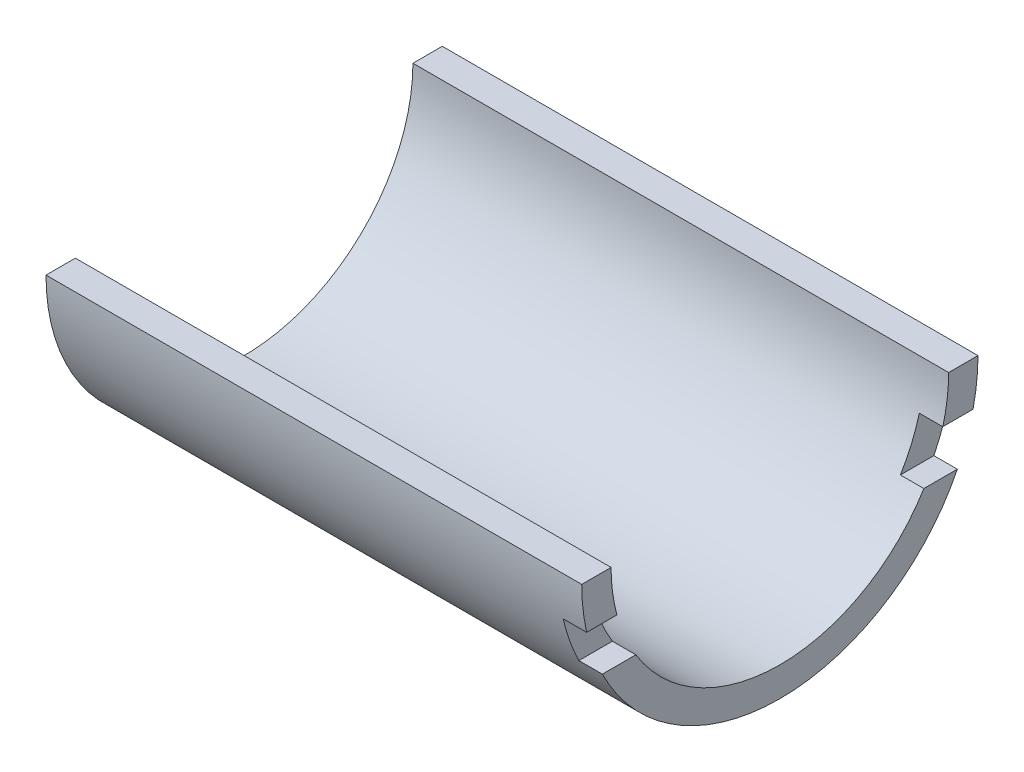
ISO-10303-21;
HEADER;
FILE_DESCRIPTION(('STEP AP214'),'2;1');
FILE_NAME('part.step','',(''),(''),'','','');
FILE_SCHEMA(('AUTOMOTIVE_DESIGN { 1 0 10303 214 1 1 1 1 }'));
ENDSEC;
DATA;
#1=APPLICATION_CONTEXT('core data for automotive mechanical design processes');
#2=APPLICATION_PROTOCOL_DEFINITION('international standard','automotive_design',2000,#1);
#3=PRODUCT_CONTEXT('',#1,'mechanical');
#4=PRODUCT('Part','Part','',(#3));
#5=PRODUCT_RELATED_PRODUCT_CATEGORY('part','',(#4));
#6=PRODUCT_DEFINITION_FORMATION('','',#4);
#7=PRODUCT_DEFINITION_CONTEXT('part definition',#1,'design');
#8=PRODUCT_DEFINITION('design','',#6,#7);
#9=PRODUCT_DEFINITION_SHAPE('','',#8);
#10=(LENGTH_UNIT() NAMED_UNIT(*) SI_UNIT(.MILLI.,.METRE.));
#11=(NAMED_UNIT(*) PLANE_ANGLE_UNIT() SI_UNIT($,.RADIAN.));
#12=(NAMED_UNIT(*) SI_UNIT($,.STERADIAN.) SOLID_ANGLE_UNIT());
#13=UNCERTAINTY_MEASURE_WITH_UNIT(LENGTH_MEASURE(1.E-05),#10,'distance_accuracy_value','');
#14=(GEOMETRIC_REPRESENTATION_CONTEXT(3) GLOBAL_UNCERTAINTY_ASSIGNED_CONTEXT((#13)) GLOBAL_UNIT_ASSIGNED_CONTEXT((#10,
#11,#12)) REPRESENTATION_CONTEXT('',''));
#15=CARTESIAN_POINT('',(0.,0.,0.));
#16=DIRECTION('',(0.,0.,1.));
#17=DIRECTION('',(1.,0.,0.));
#18=AXIS2_PLACEMENT_3D('',#15,#16,#17);
#19=CARTESIAN_POINT('',(36.5,0.,0.));
#20=DIRECTION('',(1.,0.,0.));
#21=DIRECTION('',(0.,0.,-1.));
#22=AXIS2_PLACEMENT_3D('',#19,#20,#21);
#23=PLANE('',#22);
#24=DIRECTION('',(0.,0.,-1.));
#25=VECTOR('',#24,1.);
#26=CARTESIAN_POINT('',(36.5,-12.,0.));
#27=LINE('',#26,#25);
#28=CARTESIAN_POINT('',(36.5,-12.,24.1867732448957));
#29=VERTEX_POINT('',#28);
#30=CARTESIAN_POINT('',(36.5,-12.,19.6214168703486));
#31=VERTEX_POINT('',#30);
#32=EDGE_CURVE('E150',#29,#31,#27,.T.);
#33=ORIENTED_EDGE('',*,*,#32,.F.);
#34=CARTESIAN_POINT('',(36.5,0.,0.));
#35=DIRECTION('',(1.,0.,0.));
#36=DIRECTION('',(0.,0.,-1.));
#37=AXIS2_PLACEMENT_3D('',#34,#35,#36);
#38=CIRCLE('',#37,27.);
#39=CARTESIAN_POINT('',(36.5,-12.,-24.1867732448957));
#40=VERTEX_POINT('',#39);
#41=EDGE_CURVE('E185',#29,#40,#38,.T.);
#42=ORIENTED_EDGE('',*,*,#41,.T.);
#43=CARTESIAN_POINT('',(36.5,-12.,-19.6214168703486));
#44=VERTEX_POINT('',#43);
#45=EDGE_CURVE('E151',#44,#40,#27,.T.);
#46=ORIENTED_EDGE('',*,*,#45,.F.);
#47=CARTESIAN_POINT('',(36.5,0.,0.));
#48=DIRECTION('',(1.,0.,0.));
#49=DIRECTION('',(0.,0.,-1.));
#50=AXIS2_PLACEMENT_3D('',#47,#48,#49);
#51=CIRCLE('',#50,23.);
#52=EDGE_CURVE('E193',#31,#44,#51,.T.);
#53=ORIENTED_EDGE('',*,*,#52,.F.);
#54=EDGE_LOOP('',(#33,#42,#46,#53));
#55=FACE_BOUND('',#54,.T.);
#56=ADVANCED_FACE('F39',(#55),#23,.T.);
#57=DIRECTION('',(0.,0.,1.));
#58=VECTOR('',#57,1.);
#59=CARTESIAN_POINT('',(36.5,-6.,0.));
#60=LINE('',#59,#58);
#61=CARTESIAN_POINT('',(36.5,-6.,-26.3248931621764));
#62=VERTEX_POINT('',#61);
#63=CARTESIAN_POINT('',(36.5,-6.,-22.2036033111745));
#64=VERTEX_POINT('',#63);
#65=EDGE_CURVE('E155',#62,#64,#60,.T.);
#66=ORIENTED_EDGE('',*,*,#65,.F.);
#67=CARTESIAN_POINT('',(36.5,0.,-27.));
#68=VERTEX_POINT('',#67);
#69=EDGE_CURVE('E186',#62,#68,#38,.T.);
#70=ORIENTED_EDGE('',*,*,#69,.T.);
#71=DIRECTION('',(0.,0.,-1.));
#72=VECTOR('',#71,1.);
#73=CARTESIAN_POINT('',(36.5,0.,-23.));
#74=LINE('',#73,#72);
#75=CARTESIAN_POINT('',(36.5,0.,-23.));
#76=VERTEX_POINT('',#75);
#77=EDGE_CURVE('E187',#76,#68,#74,.T.);
#78=ORIENTED_EDGE('',*,*,#77,.F.);
#79=EDGE_CURVE('E170',#64,#76,#51,.T.);
#80=ORIENTED_EDGE('',*,*,#79,.F.);
#81=EDGE_LOOP('',(#66,#70,#78,#80));
#82=FACE_BOUND('',#81,.T.);
#83=ADVANCED_FACE('F230',(#82),#23,.T.);
#84=CARTESIAN_POINT('',(36.5,0.,0.));
#85=DIRECTION('',(-1.,0.,0.));
#86=DIRECTION('',(0.,0.,1.));
#87=AXIS2_PLACEMENT_3D('',#84,#85,#86);
#88=CYLINDRICAL_SURFACE('',#87,23.);
#89=DIRECTION('',(-1.,0.,0.));
#90=VECTOR('',#89,1.);
#91=CARTESIAN_POINT('',(36.5,-12.,-19.6214168703486));
#92=LINE('',#91,#90);
#93=CARTESIAN_POINT('',(33.3,-12.,-19.6214168703486));
#94=VERTEX_POINT('',#93);
#95=EDGE_CURVE('E198',#94,#44,#92,.F.);
#96=ORIENTED_EDGE('',*,*,#95,.F.);
#97=CARTESIAN_POINT('',(33.3,0.,0.));
#98=DIRECTION('',(-1.,0.,0.));
#99=DIRECTION('',(0.,0.,1.));
#100=AXIS2_PLACEMENT_3D('',#97,#98,#99);
#101=CIRCLE('',#100,23.);
#102=CARTESIAN_POINT('',(33.3,-6.,-22.2036033111745));
#103=VERTEX_POINT('',#102);
#104=EDGE_CURVE('E180',#103,#94,#101,.T.);
#105=ORIENTED_EDGE('',*,*,#104,.F.);
#106=DIRECTION('',(-1.,0.,0.));
#107=VECTOR('',#106,1.);
#108=CARTESIAN_POINT('',(36.5,-5.99999999999999,-22.2036033111745));
#109=LINE('',#108,#107);
#110=EDGE_CURVE('E203',#64,#103,#109,.T.);
#111=ORIENTED_EDGE('',*,*,#110,.F.);
#112=ORIENTED_EDGE('',*,*,#79,.T.);
#113=DIRECTION('',(-1.,0.,0.));
#114=VECTOR('',#113,1.);
#115=CARTESIAN_POINT('',(36.5,0.,-23.));
#116=LINE('',#115,#114);
#117=CARTESIAN_POINT('',(-36.5,0.,-23.));
#118=VERTEX_POINT('',#117);
#119=EDGE_CURVE('E159',#76,#118,#116,.T.);
#120=ORIENTED_EDGE('',*,*,#119,.T.);
#121=CARTESIAN_POINT('',(-36.5,0.,0.));
#122=DIRECTION('',(1.,0.,0.));
#123=DIRECTION('',(0.,0.,-1.));
#124=AXIS2_PLACEMENT_3D('',#121,#122,#123);
#125=CIRCLE('',#124,23.);
#126=CARTESIAN_POINT('',(-36.5,0.,23.));
#127=VERTEX_POINT('',#126);
#128=EDGE_CURVE('E177',#127,#118,#125,.T.);
#129=ORIENTED_EDGE('',*,*,#128,.F.);
#130=DIRECTION('',(-1.,0.,0.));
#131=VECTOR('',#130,1.);
#132=CARTESIAN_POINT('',(36.5,0.,23.));
#133=LINE('',#132,#131);
#134=CARTESIAN_POINT('',(36.5,0.,23.));
#135=VERTEX_POINT('',#134);
#136=EDGE_CURVE('E158',#135,#127,#133,.T.);
#137=ORIENTED_EDGE('',*,*,#136,.F.);
#138=CARTESIAN_POINT('',(36.5,-6.,22.2036033111745));
#139=VERTEX_POINT('',#138);
#140=EDGE_CURVE('E190',#135,#139,#51,.T.);
#141=ORIENTED_EDGE('',*,*,#140,.T.);
#142=DIRECTION('',(-1.,0.,0.));
#143=VECTOR('',#142,1.);
#144=CARTESIAN_POINT('',(36.5,-5.99999999999999,22.2036033111745));
#145=LINE('',#144,#143);
#146=CARTESIAN_POINT('',(33.3,-6.,22.2036033111745));
#147=VERTEX_POINT('',#146);
#148=EDGE_CURVE('E62',#147,#139,#145,.F.);
#149=ORIENTED_EDGE('',*,*,#148,.F.);
#150=CARTESIAN_POINT('',(33.3,-12.,19.6214168703486));
#151=VERTEX_POINT('',#150);
#152=EDGE_CURVE('E143',#151,#147,#101,.T.);
#153=ORIENTED_EDGE('',*,*,#152,.F.);
#154=DIRECTION('',(-1.,0.,0.));
#155=VECTOR('',#154,1.);
#156=CARTESIAN_POINT('',(36.5,-12.,19.6214168703486));
#157=LINE('',#156,#155);
#158=EDGE_CURVE('E195',#31,#151,#157,.T.);
#159=ORIENTED_EDGE('',*,*,#158,.F.);
#160=ORIENTED_EDGE('',*,*,#52,.T.);
#161=EDGE_LOOP('',(#96,#105,#111,#112,#120,#129,#137,#141,#149,#153,#159,#160));
#162=FACE_BOUND('',#161,.T.);
#163=ADVANCED_FACE('F41',(#162),#88,.F.);
#164=CARTESIAN_POINT('',(36.5,0.,27.));
#165=DIRECTION('',(0.,1.,0.));
#166=DIRECTION('',(0.,0.,1.));
#167=AXIS2_PLACEMENT_3D('',#164,#165,#166);
#168=PLANE('',#167);
#169=DIRECTION('',(0.,0.,-1.));
#170=VECTOR('',#169,1.);
#171=CARTESIAN_POINT('',(-36.5,0.,27.));
#172=LINE('',#171,#170);
#173=CARTESIAN_POINT('',(-36.5,0.,27.));
#174=VERTEX_POINT('',#173);
#175=EDGE_CURVE('E167',#174,#127,#172,.T.);
#176=ORIENTED_EDGE('',*,*,#175,.F.);
#177=DIRECTION('',(-1.,0.,0.));
#178=VECTOR('',#177,1.);
#179=CARTESIAN_POINT('',(36.5,0.,27.));
#180=LINE('',#179,#178);
#181=CARTESIAN_POINT('',(36.5,0.,27.));
#182=VERTEX_POINT('',#181);
#183=EDGE_CURVE('E164',#182,#174,#180,.T.);
#184=ORIENTED_EDGE('',*,*,#183,.F.);
#185=DIRECTION('',(0.,0.,-1.));
#186=VECTOR('',#185,1.);
#187=CARTESIAN_POINT('',(36.5,0.,27.));
#188=LINE('',#187,#186);
#189=EDGE_CURVE('E162',#182,#135,#188,.T.);
#190=ORIENTED_EDGE('',*,*,#189,.T.);
#191=ORIENTED_EDGE('',*,*,#136,.T.);
#192=EDGE_LOOP('',(#176,#184,#190,#191));
#193=FACE_BOUND('',#192,.T.);
#194=ADVANCED_FACE('F242',(#193),#168,.T.);
#195=CARTESIAN_POINT('',(36.5,0.,0.));
#196=DIRECTION('',(-1.,0.,0.));
#197=DIRECTION('',(0.,0.,1.));
#198=AXIS2_PLACEMENT_3D('',#195,#196,#197);
#199=CYLINDRICAL_SURFACE('',#198,27.);
#200=CARTESIAN_POINT('',(33.3,0.,0.));
#201=DIRECTION('',(-1.,0.,0.));
#202=DIRECTION('',(0.,0.,1.));
#203=AXIS2_PLACEMENT_3D('',#200,#201,#202);
#204=CIRCLE('',#203,27.);
#205=CARTESIAN_POINT('',(33.3,-6.,-26.3248931621764));
#206=VERTEX_POINT('',#205);
#207=CARTESIAN_POINT('',(33.3,-12.,-24.1867732448957));
#208=VERTEX_POINT('',#207);
#209=EDGE_CURVE('E11',#206,#208,#204,.T.);
#210=ORIENTED_EDGE('',*,*,#209,.T.);
#211=DIRECTION('',(-1.,0.,0.));
#212=VECTOR('',#211,1.);
#213=CARTESIAN_POINT('',(36.5,-12.,-24.1867732448957));
#214=LINE('',#213,#212);
#215=EDGE_CURVE('E200',#208,#40,#214,.F.);
#216=ORIENTED_EDGE('',*,*,#215,.T.);
#217=ORIENTED_EDGE('',*,*,#41,.F.);
#218=DIRECTION('',(-1.,0.,0.));
#219=VECTOR('',#218,1.);
#220=CARTESIAN_POINT('',(36.5,-12.,24.1867732448957));
#221=LINE('',#220,#219);
#222=CARTESIAN_POINT('',(33.3,-12.,24.1867732448957));
#223=VERTEX_POINT('',#222);
#224=EDGE_CURVE('E149',#29,#223,#221,.T.);
#225=ORIENTED_EDGE('',*,*,#224,.T.);
#226=CARTESIAN_POINT('',(33.3,-6.,26.3248931621764));
#227=VERTEX_POINT('',#226);
#228=EDGE_CURVE('E43',#223,#227,#204,.T.);
#229=ORIENTED_EDGE('',*,*,#228,.T.);
#230=DIRECTION('',(-1.,0.,0.));
#231=VECTOR('',#230,1.);
#232=CARTESIAN_POINT('',(36.5,-5.99999999999999,26.3248931621764));
#233=LINE('',#232,#231);
#234=CARTESIAN_POINT('',(36.5,-6.,26.3248931621764));
#235=VERTEX_POINT('',#234);
#236=EDGE_CURVE('E128',#227,#235,#233,.F.);
#237=ORIENTED_EDGE('',*,*,#236,.T.);
#238=EDGE_CURVE('E183',#182,#235,#38,.T.);
#239=ORIENTED_EDGE('',*,*,#238,.F.);
#240=ORIENTED_EDGE('',*,*,#183,.T.);
#241=CARTESIAN_POINT('',(-36.5,0.,0.));
#242=DIRECTION('',(1.,0.,0.));
#243=DIRECTION('',(0.,0.,-1.));
#244=AXIS2_PLACEMENT_3D('',#241,#242,#243);
#245=CIRCLE('',#244,27.);
#246=CARTESIAN_POINT('',(-36.5,0.,-27.));
#247=VERTEX_POINT('',#246);
#248=EDGE_CURVE('E171',#174,#247,#245,.T.);
#249=ORIENTED_EDGE('',*,*,#248,.T.);
#250=DIRECTION('',(-1.,0.,0.));
#251=VECTOR('',#250,1.);
#252=CARTESIAN_POINT('',(36.5,0.,-27.));
#253=LINE('',#252,#251);
#254=EDGE_CURVE('E161',#68,#247,#253,.T.);
#255=ORIENTED_EDGE('',*,*,#254,.F.);
#256=ORIENTED_EDGE('',*,*,#69,.F.);
#257=DIRECTION('',(-1.,0.,0.));
#258=VECTOR('',#257,1.);
#259=CARTESIAN_POINT('',(36.5,-5.99999999999999,-26.3248931621764));
#260=LINE('',#259,#258);
#261=EDGE_CURVE('E54',#62,#206,#260,.T.);
#262=ORIENTED_EDGE('',*,*,#261,.T.);
#263=EDGE_LOOP('',(#210,#216,#217,#225,#229,#237,#239,#240,#249,#255,#256,#262));
#264=FACE_BOUND('',#263,.T.);
#265=ADVANCED_FACE('F147',(#264),#199,.T.);
#266=CARTESIAN_POINT('',(36.5,0.,-23.));
#267=DIRECTION('',(0.,1.,0.));
#268=DIRECTION('',(0.,0.,1.));
#269=AXIS2_PLACEMENT_3D('',#266,#267,#268);
#270=PLANE('',#269);
#271=DIRECTION('',(0.,0.,-1.));
#272=VECTOR('',#271,1.);
#273=CARTESIAN_POINT('',(-36.5,0.,-23.));
#274=LINE('',#273,#272);
#275=EDGE_CURVE('E174',#118,#247,#274,.T.);
#276=ORIENTED_EDGE('',*,*,#275,.F.);
#277=ORIENTED_EDGE('',*,*,#119,.F.);
#278=ORIENTED_EDGE('',*,*,#77,.T.);
#279=ORIENTED_EDGE('',*,*,#254,.T.);
#280=EDGE_LOOP('',(#276,#277,#278,#279));
#281=FACE_BOUND('',#280,.T.);
#282=ADVANCED_FACE('F229',(#281),#270,.T.);
#283=EDGE_CURVE('E132',#139,#235,#60,.T.);
#284=ORIENTED_EDGE('',*,*,#283,.F.);
#285=ORIENTED_EDGE('',*,*,#140,.F.);
#286=ORIENTED_EDGE('',*,*,#189,.F.);
#287=ORIENTED_EDGE('',*,*,#238,.T.);
#288=EDGE_LOOP('',(#284,#285,#286,#287));
#289=FACE_BOUND('',#288,.T.);
#290=ADVANCED_FACE('F241',(#289),#23,.T.);
#291=CARTESIAN_POINT('',(-36.5,0.,0.));
#292=DIRECTION('',(1.,0.,0.));
#293=DIRECTION('',(0.,0.,-1.));
#294=AXIS2_PLACEMENT_3D('',#291,#292,#293);
#295=PLANE('',#294);
#296=ORIENTED_EDGE('',*,*,#128,.T.);
#297=ORIENTED_EDGE('',*,*,#275,.T.);
#298=ORIENTED_EDGE('',*,*,#248,.F.);
#299=ORIENTED_EDGE('',*,*,#175,.T.);
#300=EDGE_LOOP('',(#296,#297,#298,#299));
#301=FACE_BOUND('',#300,.T.);
#302=ADVANCED_FACE('F236',(#301),#295,.F.);
#303=CARTESIAN_POINT('',(36.500012,-6.,0.));
#304=DIRECTION('',(0.,1.,0.));
#305=DIRECTION('',(0.,0.,1.));
#306=AXIS2_PLACEMENT_3D('',#303,#304,#305);
#307=PLANE('',#306);
#308=ORIENTED_EDGE('',*,*,#148,.T.);
#309=ORIENTED_EDGE('',*,*,#283,.T.);
#310=ORIENTED_EDGE('',*,*,#236,.F.);
#311=DIRECTION('',(0.,0.,-1.));
#312=VECTOR('',#311,1.);
#313=CARTESIAN_POINT('',(33.3,-6.,0.));
#314=LINE('',#313,#312);
#315=EDGE_CURVE('E131',#227,#147,#314,.T.);
#316=ORIENTED_EDGE('',*,*,#315,.T.);
#317=EDGE_LOOP('',(#308,#309,#310,#316));
#318=FACE_BOUND('',#317,.T.);
#319=ADVANCED_FACE('F130',(#318),#307,.F.);
#320=CARTESIAN_POINT('',(36.500012,-12.,0.));
#321=DIRECTION('',(0.,-1.,0.));
#322=DIRECTION('',(0.,0.,-1.));
#323=AXIS2_PLACEMENT_3D('',#320,#321,#322);
#324=PLANE('',#323);
#325=ORIENTED_EDGE('',*,*,#158,.T.);
#326=DIRECTION('',(0.,0.,1.));
#327=VECTOR('',#326,1.);
#328=CARTESIAN_POINT('',(33.3,-12.,0.));
#329=LINE('',#328,#327);
#330=EDGE_CURVE('E208',#151,#223,#329,.T.);
#331=ORIENTED_EDGE('',*,*,#330,.T.);
#332=ORIENTED_EDGE('',*,*,#224,.F.);
#333=ORIENTED_EDGE('',*,*,#32,.T.);
#334=EDGE_LOOP('',(#325,#331,#332,#333));
#335=FACE_BOUND('',#334,.T.);
#336=ADVANCED_FACE('F292',(#335),#324,.F.);
#337=CARTESIAN_POINT('',(33.3,0.,0.));
#338=DIRECTION('',(-1.,0.,0.));
#339=DIRECTION('',(0.,0.,1.));
#340=AXIS2_PLACEMENT_3D('',#337,#338,#339);
#341=PLANE('',#340);
#342=ORIENTED_EDGE('',*,*,#152,.T.);
#343=ORIENTED_EDGE('',*,*,#315,.F.);
#344=ORIENTED_EDGE('',*,*,#228,.F.);
#345=ORIENTED_EDGE('',*,*,#330,.F.);
#346=EDGE_LOOP('',(#342,#343,#344,#345));
#347=FACE_BOUND('',#346,.T.);
#348=ADVANCED_FACE('F139',(#347),#341,.F.);
#349=ORIENTED_EDGE('',*,*,#104,.T.);
#350=EDGE_CURVE('E207',#208,#94,#329,.T.);
#351=ORIENTED_EDGE('',*,*,#350,.F.);
#352=ORIENTED_EDGE('',*,*,#209,.F.);
#353=EDGE_CURVE('E144',#103,#206,#314,.T.);
#354=ORIENTED_EDGE('',*,*,#353,.F.);
#355=EDGE_LOOP('',(#349,#351,#352,#354));
#356=FACE_BOUND('',#355,.T.);
#357=ADVANCED_FACE('F309',(#356),#341,.F.);
#358=ORIENTED_EDGE('',*,*,#110,.T.);
#359=ORIENTED_EDGE('',*,*,#353,.T.);
#360=ORIENTED_EDGE('',*,*,#261,.F.);
#361=ORIENTED_EDGE('',*,*,#65,.T.);
#362=EDGE_LOOP('',(#358,#359,#360,#361));
#363=FACE_BOUND('',#362,.T.);
#364=ADVANCED_FACE('F294',(#363),#307,.F.);
#365=ORIENTED_EDGE('',*,*,#95,.T.);
#366=ORIENTED_EDGE('',*,*,#45,.T.);
#367=ORIENTED_EDGE('',*,*,#215,.F.);
#368=ORIENTED_EDGE('',*,*,#350,.T.);
#369=EDGE_LOOP('',(#365,#366,#367,#368));
#370=FACE_BOUND('',#369,.T.);
#371=ADVANCED_FACE('F213',(#370),#324,.F.);
#372=CLOSED_SHELL('',(#56,#83,#163,#194,#265,#282,#290,#302,#319,#336,#348,#357,#364,#371));
#373=MANIFOLD_SOLID_BREP('B2',#372);
#374=ADVANCED_BREP_SHAPE_REPRESENTATION('',(#18,#373),#14);
#375=SHAPE_DEFINITION_REPRESENTATION(#9,#374);
ENDSEC;
END-ISO-10303-21;
